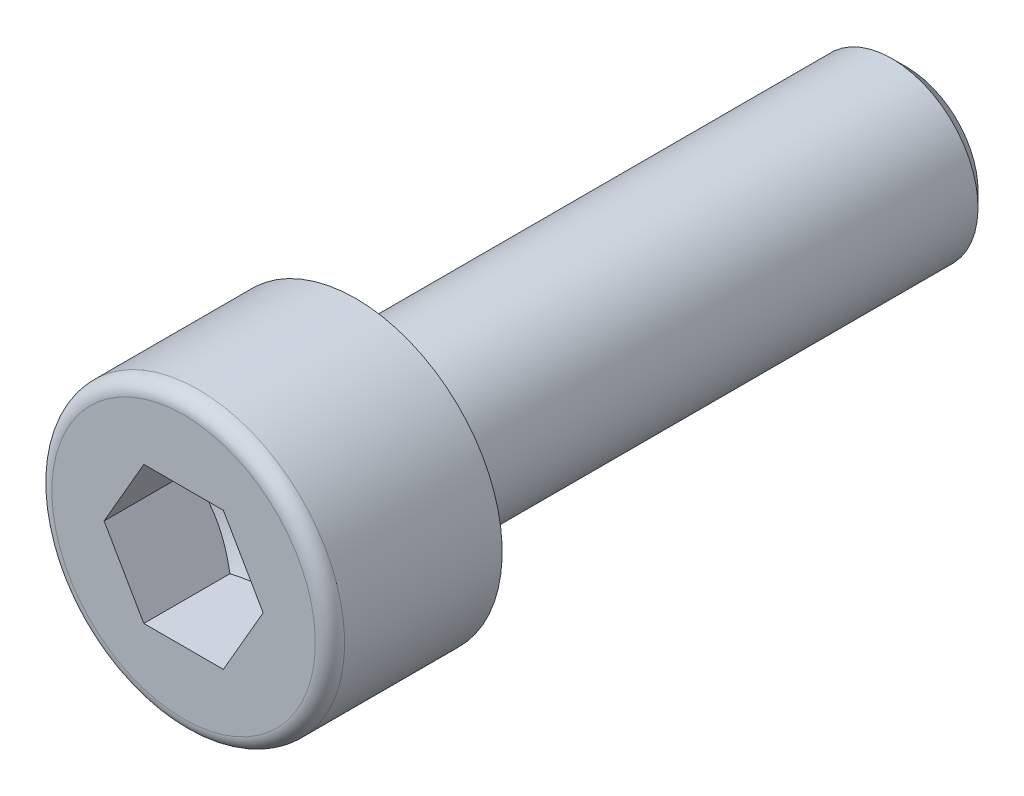
ISO-10303-21;
HEADER;
FILE_DESCRIPTION(('STEP AP214'),'2;1');
FILE_NAME('part.step','',(''),(''),'','','');
FILE_SCHEMA(('AUTOMOTIVE_DESIGN { 1 0 10303 214 1 1 1 1 }'));
ENDSEC;
DATA;
#1=APPLICATION_CONTEXT('core data for automotive mechanical design processes');
#2=APPLICATION_PROTOCOL_DEFINITION('international standard','automotive_design',2000,#1);
#3=PRODUCT_CONTEXT('',#1,'mechanical');
#4=PRODUCT('Part','Part','',(#3));
#5=PRODUCT_RELATED_PRODUCT_CATEGORY('part','',(#4));
#6=PRODUCT_DEFINITION_FORMATION('','',#4);
#7=PRODUCT_DEFINITION_CONTEXT('part definition',#1,'design');
#8=PRODUCT_DEFINITION('design','',#6,#7);
#9=PRODUCT_DEFINITION_SHAPE('','',#8);
#10=(LENGTH_UNIT() NAMED_UNIT(*) SI_UNIT(.MILLI.,.METRE.));
#11=(NAMED_UNIT(*) PLANE_ANGLE_UNIT() SI_UNIT($,.RADIAN.));
#12=(NAMED_UNIT(*) SI_UNIT($,.STERADIAN.) SOLID_ANGLE_UNIT());
#13=UNCERTAINTY_MEASURE_WITH_UNIT(LENGTH_MEASURE(1.E-05),#10,'distance_accuracy_value','');
#14=(GEOMETRIC_REPRESENTATION_CONTEXT(3) GLOBAL_UNCERTAINTY_ASSIGNED_CONTEXT((#13)) GLOBAL_UNIT_ASSIGNED_CONTEXT((#10,
#11,#12)) REPRESENTATION_CONTEXT('',''));
#15=CARTESIAN_POINT('',(0.,0.,0.));
#16=DIRECTION('',(0.,0.,1.));
#17=DIRECTION('',(1.,0.,0.));
#18=AXIS2_PLACEMENT_3D('',#15,#16,#17);
#19=CARTESIAN_POINT('',(0.,0.,1.83333364416674));
#20=DIRECTION('',(0.,0.,1.));
#21=DIRECTION('',(0.,1.,0.));
#22=AXIS2_PLACEMENT_3D('',#19,#20,#21);
#23=CONICAL_SURFACE('',#22,1.1547,1.0471975511966);
#24=CARTESIAN_POINT('',(1.1547,1.99999906749978,2.5));
#25=CARTESIAN_POINT('',(1.73205,0.999999533749893,2.16666682208337));
#26=CARTESIAN_POINT('',(2.3094,0.,2.5));
#27=(BOUNDED_CURVE() B_SPLINE_CURVE(2,(#24,#25,#26),.UNSPECIFIED.,.F.,
.F.) B_SPLINE_CURVE_WITH_KNOTS((3,3),(0.,2.33687118658889),
.UNSPECIFIED.) CURVE() GEOMETRIC_REPRESENTATION_ITEM() RATIONAL_B_SPLINE_CURVE((1.,
1.15470053837925,1.)) REPRESENTATION_ITEM(''));
#28=CARTESIAN_POINT('',(1.1547,1.99999906749978,2.5));
#29=VERTEX_POINT('',#28);
#30=CARTESIAN_POINT('',(2.3094,0.,2.5));
#31=VERTEX_POINT('',#30);
#32=EDGE_CURVE('E153',#29,#31,#27,.T.);
#33=ORIENTED_EDGE('',*,*,#32,.F.);
#34=CARTESIAN_POINT('',(-1.1547,1.99999906749978,2.5));
#35=CARTESIAN_POINT('',(0.,1.99999906749979,2.16666682208337));
#36=CARTESIAN_POINT('',(1.1547,1.99999906749978,2.5));
#37=(BOUNDED_CURVE() B_SPLINE_CURVE(2,(#34,#35,#36),.UNSPECIFIED.,.F.,
.F.) B_SPLINE_CURVE_WITH_KNOTS((3,3),(0.,2.33687118658889),
.UNSPECIFIED.) CURVE() GEOMETRIC_REPRESENTATION_ITEM() RATIONAL_B_SPLINE_CURVE((1.,
1.15470053837925,1.)) REPRESENTATION_ITEM(''));
#38=CARTESIAN_POINT('',(-1.1547,1.99999906749978,2.5));
#39=VERTEX_POINT('',#38);
#40=EDGE_CURVE('E37',#39,#29,#37,.T.);
#41=ORIENTED_EDGE('',*,*,#40,.F.);
#42=CARTESIAN_POINT('',(-2.3094,0.,2.5));
#43=CARTESIAN_POINT('',(-1.73205,0.999999533749893,2.16666682208337));
#44=CARTESIAN_POINT('',(-1.1547,1.99999906749978,2.5));
#45=(BOUNDED_CURVE() B_SPLINE_CURVE(2,(#42,#43,#44),.UNSPECIFIED.,.F.,
.F.) B_SPLINE_CURVE_WITH_KNOTS((3,3),(0.,2.33687118658889),
.UNSPECIFIED.) CURVE() GEOMETRIC_REPRESENTATION_ITEM() RATIONAL_B_SPLINE_CURVE((1.,
1.15470053837925,1.)) REPRESENTATION_ITEM(''));
#46=CARTESIAN_POINT('',(-2.3094,0.,2.5));
#47=VERTEX_POINT('',#46);
#48=EDGE_CURVE('E181',#47,#39,#45,.T.);
#49=ORIENTED_EDGE('',*,*,#48,.F.);
#50=CARTESIAN_POINT('',(-1.1547,-1.99999906749978,2.5));
#51=CARTESIAN_POINT('',(-1.73205,-0.999999533749891,2.16666682208337));
#52=CARTESIAN_POINT('',(-2.3094,0.,2.5));
#53=(BOUNDED_CURVE() B_SPLINE_CURVE(2,(#50,#51,#52),.UNSPECIFIED.,.F.,
.F.) B_SPLINE_CURVE_WITH_KNOTS((3,3),(0.,2.33687118658889),
.UNSPECIFIED.) CURVE() GEOMETRIC_REPRESENTATION_ITEM() RATIONAL_B_SPLINE_CURVE((1.,
1.15470053837925,1.)) REPRESENTATION_ITEM(''));
#54=CARTESIAN_POINT('',(-1.1547,-1.99999906749978,2.5));
#55=VERTEX_POINT('',#54);
#56=EDGE_CURVE('E11',#55,#47,#53,.T.);
#57=ORIENTED_EDGE('',*,*,#56,.F.);
#58=CARTESIAN_POINT('',(1.1547,-1.99999906749978,2.5));
#59=CARTESIAN_POINT('',(0.,-1.99999906749979,2.16666682208337));
#60=CARTESIAN_POINT('',(-1.1547,-1.99999906749978,2.5));
#61=(BOUNDED_CURVE() B_SPLINE_CURVE(2,(#58,#59,#60),.UNSPECIFIED.,.F.,
.F.) B_SPLINE_CURVE_WITH_KNOTS((3,3),(0.,2.33687118658889),
.UNSPECIFIED.) CURVE() GEOMETRIC_REPRESENTATION_ITEM() RATIONAL_B_SPLINE_CURVE((1.,
1.15470053837925,1.)) REPRESENTATION_ITEM(''));
#62=CARTESIAN_POINT('',(1.1547,-1.99999906749978,2.5));
#63=VERTEX_POINT('',#62);
#64=EDGE_CURVE('E52',#63,#55,#61,.T.);
#65=ORIENTED_EDGE('',*,*,#64,.F.);
#66=CARTESIAN_POINT('',(2.3094,0.,2.5));
#67=CARTESIAN_POINT('',(1.73205,-0.999999533749891,2.16666682208337));
#68=CARTESIAN_POINT('',(1.1547,-1.99999906749978,2.5));
#69=(BOUNDED_CURVE() B_SPLINE_CURVE(2,(#66,#67,#68),.UNSPECIFIED.,.F.,
.F.) B_SPLINE_CURVE_WITH_KNOTS((3,3),(0.,2.33687118658888),
.UNSPECIFIED.) CURVE() GEOMETRIC_REPRESENTATION_ITEM() RATIONAL_B_SPLINE_CURVE((1.,
1.15470053837925,1.)) REPRESENTATION_ITEM(''));
#70=EDGE_CURVE('E20',#31,#63,#69,.T.);
#71=ORIENTED_EDGE('',*,*,#70,.F.);
#72=EDGE_LOOP('',(#33,#41,#49,#57,#65,#71));
#73=FACE_BOUND('',#72,.T.);
#74=CARTESIAN_POINT('',(0.,0.,1.16666728833348));
#75=VERTEX_POINT('',#74);
#76=VERTEX_LOOP('',#75);
#77=FACE_BOUND('',#76,.T.);
#78=ADVANCED_FACE('F16',(#73,#77),#23,.F.);
#79=CARTESIAN_POINT('',(-1.73205,-0.999999533749891,5.));
#80=DIRECTION('',(-0.866025403784439,-0.5,0.));
#81=DIRECTION('',(-0.5,0.866025403784439,0.));
#82=AXIS2_PLACEMENT_3D('',#79,#80,#81);
#83=PLANE('',#82);
#84=ORIENTED_EDGE('',*,*,#56,.T.);
#85=DIRECTION('',(0.,0.,-1.));
#86=VECTOR('',#85,1.);
#87=CARTESIAN_POINT('',(-2.3094,0.,5.));
#88=LINE('',#87,#86);
#89=CARTESIAN_POINT('',(-2.3094,0.,5.));
#90=VERTEX_POINT('',#89);
#91=EDGE_CURVE('E179',#90,#47,#88,.T.);
#92=ORIENTED_EDGE('',*,*,#91,.F.);
#93=DIRECTION('',(-0.5,0.866025403784439,0.));
#94=VECTOR('',#93,1.);
#95=CARTESIAN_POINT('',(-2.14611839618444,-0.282812033749892,5.));
#96=LINE('',#95,#94);
#97=CARTESIAN_POINT('',(-1.1547,-1.99999906749978,5.));
#98=VERTEX_POINT('',#97);
#99=EDGE_CURVE('E133',#98,#90,#96,.T.);
#100=ORIENTED_EDGE('',*,*,#99,.F.);
#101=DIRECTION('',(0.,0.,-1.));
#102=VECTOR('',#101,1.);
#103=CARTESIAN_POINT('',(-1.1547,-1.99999906749978,5.));
#104=LINE('',#103,#102);
#105=EDGE_CURVE('E28',#98,#55,#104,.T.);
#106=ORIENTED_EDGE('',*,*,#105,.T.);
#107=EDGE_LOOP('',(#84,#92,#100,#106));
#108=FACE_BOUND('',#107,.T.);
#109=ADVANCED_FACE('F221',(#108),#83,.F.);
#110=CARTESIAN_POINT('',(0.,-1.99999906749978,5.));
#111=DIRECTION('',(0.,-1.,0.));
#112=DIRECTION('',(-1.,0.,0.));
#113=AXIS2_PLACEMENT_3D('',#110,#111,#112);
#114=PLANE('',#113);
#115=ORIENTED_EDGE('',*,*,#64,.T.);
#116=ORIENTED_EDGE('',*,*,#105,.F.);
#117=DIRECTION('',(-1.,0.,0.));
#118=VECTOR('',#117,1.);
#119=CARTESIAN_POINT('',(0.,-1.99999906749978,5.));
#120=LINE('',#119,#118);
#121=CARTESIAN_POINT('',(1.1547,-1.99999906749978,5.));
#122=VERTEX_POINT('',#121);
#123=EDGE_CURVE('E110',#122,#98,#120,.T.);
#124=ORIENTED_EDGE('',*,*,#123,.F.);
#125=DIRECTION('',(0.,0.,-1.));
#126=VECTOR('',#125,1.);
#127=CARTESIAN_POINT('',(1.1547,-1.99999906749978,5.));
#128=LINE('',#127,#126);
#129=EDGE_CURVE('E111',#122,#63,#128,.T.);
#130=ORIENTED_EDGE('',*,*,#129,.T.);
#131=EDGE_LOOP('',(#115,#116,#124,#130));
#132=FACE_BOUND('',#131,.T.);
#133=ADVANCED_FACE('F18',(#132),#114,.F.);
#134=CARTESIAN_POINT('',(1.73205,-0.999999533749891,5.));
#135=DIRECTION('',(0.866025403784439,-0.5,0.));
#136=DIRECTION('',(-0.5,-0.866025403784439,0.));
#137=AXIS2_PLACEMENT_3D('',#134,#135,#136);
#138=PLANE('',#137);
#139=ORIENTED_EDGE('',*,*,#70,.T.);
#140=ORIENTED_EDGE('',*,*,#129,.F.);
#141=DIRECTION('',(-0.5,-0.866025403784439,0.));
#142=VECTOR('',#141,1.);
#143=CARTESIAN_POINT('',(2.14611839618444,-0.282812033749892,5.));
#144=LINE('',#143,#142);
#145=CARTESIAN_POINT('',(2.3094,0.,5.));
#146=VERTEX_POINT('',#145);
#147=EDGE_CURVE('E115',#146,#122,#144,.T.);
#148=ORIENTED_EDGE('',*,*,#147,.F.);
#149=DIRECTION('',(0.,0.,-1.));
#150=VECTOR('',#149,1.);
#151=CARTESIAN_POINT('',(2.3094,0.,5.));
#152=LINE('',#151,#150);
#153=EDGE_CURVE('E152',#146,#31,#152,.T.);
#154=ORIENTED_EDGE('',*,*,#153,.T.);
#155=EDGE_LOOP('',(#139,#140,#148,#154));
#156=FACE_BOUND('',#155,.T.);
#157=ADVANCED_FACE('F117',(#156),#138,.F.);
#158=CARTESIAN_POINT('',(1.73205,0.999999533749891,5.));
#159=DIRECTION('',(0.866025403784439,0.5,0.));
#160=DIRECTION('',(0.5,-0.866025403784439,0.));
#161=AXIS2_PLACEMENT_3D('',#158,#159,#160);
#162=PLANE('',#161);
#163=ORIENTED_EDGE('',*,*,#32,.T.);
#164=ORIENTED_EDGE('',*,*,#153,.F.);
#165=DIRECTION('',(0.5,-0.866025403784439,0.));
#166=VECTOR('',#165,1.);
#167=CARTESIAN_POINT('',(1.31798160381557,1.71718703374989,5.));
#168=LINE('',#167,#166);
#169=CARTESIAN_POINT('',(1.1547,1.99999906749978,5.));
#170=VERTEX_POINT('',#169);
#171=EDGE_CURVE('E125',#170,#146,#168,.T.);
#172=ORIENTED_EDGE('',*,*,#171,.F.);
#173=DIRECTION('',(0.,0.,-1.));
#174=VECTOR('',#173,1.);
#175=CARTESIAN_POINT('',(1.1547,1.99999906749978,5.));
#176=LINE('',#175,#174);
#177=EDGE_CURVE('E154',#170,#29,#176,.T.);
#178=ORIENTED_EDGE('',*,*,#177,.T.);
#179=EDGE_LOOP('',(#163,#164,#172,#178));
#180=FACE_BOUND('',#179,.T.);
#181=ADVANCED_FACE('F232',(#180),#162,.F.);
#182=CARTESIAN_POINT('',(0.,1.99999906749978,5.));
#183=DIRECTION('',(0.,1.,0.));
#184=DIRECTION('',(1.,0.,0.));
#185=AXIS2_PLACEMENT_3D('',#182,#183,#184);
#186=PLANE('',#185);
#187=ORIENTED_EDGE('',*,*,#40,.T.);
#188=ORIENTED_EDGE('',*,*,#177,.F.);
#189=DIRECTION('',(1.,0.,0.));
#190=VECTOR('',#189,1.);
#191=CARTESIAN_POINT('',(0.,1.99999906749978,5.));
#192=LINE('',#191,#190);
#193=CARTESIAN_POINT('',(-1.1547,1.99999906749978,5.));
#194=VERTEX_POINT('',#193);
#195=EDGE_CURVE('E127',#194,#170,#192,.T.);
#196=ORIENTED_EDGE('',*,*,#195,.F.);
#197=DIRECTION('',(0.,0.,-1.));
#198=VECTOR('',#197,1.);
#199=CARTESIAN_POINT('',(-1.1547,1.99999906749978,5.));
#200=LINE('',#199,#198);
#201=EDGE_CURVE('E191',#194,#39,#200,.T.);
#202=ORIENTED_EDGE('',*,*,#201,.T.);
#203=EDGE_LOOP('',(#187,#188,#196,#202));
#204=FACE_BOUND('',#203,.T.);
#205=ADVANCED_FACE('F234',(#204),#186,.F.);
#206=CARTESIAN_POINT('',(-1.73205,0.999999533749891,5.));
#207=DIRECTION('',(-0.866025403784439,0.5,0.));
#208=DIRECTION('',(0.5,0.866025403784439,0.));
#209=AXIS2_PLACEMENT_3D('',#206,#207,#208);
#210=PLANE('',#209);
#211=ORIENTED_EDGE('',*,*,#48,.T.);
#212=ORIENTED_EDGE('',*,*,#201,.F.);
#213=DIRECTION('',(0.5,0.866025403784439,0.));
#214=VECTOR('',#213,1.);
#215=CARTESIAN_POINT('',(-1.31798160381557,1.71718703374989,5.));
#216=LINE('',#215,#214);
#217=EDGE_CURVE('E131',#90,#194,#216,.T.);
#218=ORIENTED_EDGE('',*,*,#217,.F.);
#219=ORIENTED_EDGE('',*,*,#91,.T.);
#220=EDGE_LOOP('',(#211,#212,#218,#219));
#221=FACE_BOUND('',#220,.T.);
#222=ADVANCED_FACE('F207',(#221),#210,.F.);
#223=CARTESIAN_POINT('',(0.,0.,4.575));
#224=DIRECTION('',(0.,0.,-1.));
#225=DIRECTION('',(-1.,0.,0.));
#226=AXIS2_PLACEMENT_3D('',#223,#224,#225);
#227=TOROIDAL_SURFACE('',#226,3.825,0.425);
#228=CARTESIAN_POINT('',(0.,0.,4.575));
#229=DIRECTION('',(0.,0.,-1.));
#230=DIRECTION('',(0.,1.,0.));
#231=AXIS2_PLACEMENT_3D('',#228,#229,#230);
#232=CIRCLE('',#231,4.25);
#233=CARTESIAN_POINT('',(0.,4.25,4.575));
#234=VERTEX_POINT('',#233);
#235=EDGE_CURVE('E184',#234,#234,#232,.T.);
#236=ORIENTED_EDGE('',*,*,#235,.F.);
#237=EDGE_LOOP('',(#236));
#238=FACE_BOUND('',#237,.T.);
#239=CARTESIAN_POINT('',(0.,0.,5.));
#240=DIRECTION('',(0.,0.,-1.));
#241=DIRECTION('',(0.,1.,0.));
#242=AXIS2_PLACEMENT_3D('',#239,#240,#241);
#243=CIRCLE('',#242,3.825);
#244=CARTESIAN_POINT('',(0.,3.825,5.));
#245=VERTEX_POINT('',#244);
#246=EDGE_CURVE('E182',#245,#245,#243,.T.);
#247=ORIENTED_EDGE('',*,*,#246,.T.);
#248=EDGE_LOOP('',(#247));
#249=FACE_BOUND('',#248,.T.);
#250=ADVANCED_FACE('F202',(#238,#249),#227,.T.);
#251=CARTESIAN_POINT('',(0.,0.,2.2875));
#252=DIRECTION('',(0.,0.,1.));
#253=DIRECTION('',(0.,1.,0.));
#254=AXIS2_PLACEMENT_3D('',#251,#252,#253);
#255=CYLINDRICAL_SURFACE('',#254,4.25);
#256=CARTESIAN_POINT('',(0.,0.,0.));
#257=DIRECTION('',(0.,0.,-1.));
#258=DIRECTION('',(0.,1.,0.));
#259=AXIS2_PLACEMENT_3D('',#256,#257,#258);
#260=CIRCLE('',#259,4.25);
#261=CARTESIAN_POINT('',(0.,4.25,0.));
#262=VERTEX_POINT('',#261);
#263=EDGE_CURVE('E150',#262,#262,#260,.T.);
#264=ORIENTED_EDGE('',*,*,#263,.F.);
#265=EDGE_LOOP('',(#264));
#266=FACE_BOUND('',#265,.T.);
#267=ORIENTED_EDGE('',*,*,#235,.T.);
#268=EDGE_LOOP('',(#267));
#269=FACE_BOUND('',#268,.T.);
#270=ADVANCED_FACE('F199',(#266,#269),#255,.T.);
#271=CARTESIAN_POINT('',(0.,3.5,0.));
#272=DIRECTION('',(0.,0.,-1.));
#273=DIRECTION('',(0.,1.,0.));
#274=AXIS2_PLACEMENT_3D('',#271,#272,#273);
#275=PLANE('',#274);
#276=CARTESIAN_POINT('',(0.,0.,0.));
#277=DIRECTION('',(0.,0.,-1.));
#278=DIRECTION('',(0.,1.,0.));
#279=AXIS2_PLACEMENT_3D('',#276,#277,#278);
#280=CIRCLE('',#279,2.75);
#281=CARTESIAN_POINT('',(0.,2.75,0.));
#282=VERTEX_POINT('',#281);
#283=EDGE_CURVE('E147',#282,#282,#280,.T.);
#284=ORIENTED_EDGE('',*,*,#283,.F.);
#285=EDGE_LOOP('',(#284));
#286=FACE_BOUND('',#285,.T.);
#287=ORIENTED_EDGE('',*,*,#263,.T.);
#288=EDGE_LOOP('',(#287));
#289=FACE_BOUND('',#288,.T.);
#290=ADVANCED_FACE('F197',(#286,#289),#275,.T.);
#291=CARTESIAN_POINT('',(0.,0.,-0.25));
#292=DIRECTION('',(0.,0.,-1.));
#293=DIRECTION('',(-1.,0.,0.));
#294=AXIS2_PLACEMENT_3D('',#291,#292,#293);
#295=TOROIDAL_SURFACE('',#294,2.75,0.25);
#296=CARTESIAN_POINT('',(0.,0.,-0.25));
#297=DIRECTION('',(0.,0.,-1.));
#298=DIRECTION('',(0.,1.,0.));
#299=AXIS2_PLACEMENT_3D('',#296,#297,#298);
#300=CIRCLE('',#299,2.5);
#301=CARTESIAN_POINT('',(0.,2.5,-0.25));
#302=VERTEX_POINT('',#301);
#303=EDGE_CURVE('E151',#302,#302,#300,.T.);
#304=ORIENTED_EDGE('',*,*,#303,.F.);
#305=EDGE_LOOP('',(#304));
#306=FACE_BOUND('',#305,.T.);
#307=ORIENTED_EDGE('',*,*,#283,.T.);
#308=EDGE_LOOP('',(#307));
#309=FACE_BOUND('',#308,.T.);
#310=ADVANCED_FACE('F277',(#306,#309),#295,.F.);
#311=CARTESIAN_POINT('',(0.,0.,-0.275));
#312=DIRECTION('',(0.,0.,1.));
#313=DIRECTION('',(0.,1.,0.));
#314=AXIS2_PLACEMENT_3D('',#311,#312,#313);
#315=CYLINDRICAL_SURFACE('',#314,2.5);
#316=CARTESIAN_POINT('',(0.,0.,-0.3));
#317=DIRECTION('',(0.,0.,-1.));
#318=DIRECTION('',(0.,1.,0.));
#319=AXIS2_PLACEMENT_3D('',#316,#317,#318);
#320=CIRCLE('',#319,2.5);
#321=CARTESIAN_POINT('',(0.,2.5,-0.3));
#322=VERTEX_POINT('',#321);
#323=EDGE_CURVE('E170',#322,#322,#320,.T.);
#324=ORIENTED_EDGE('',*,*,#323,.F.);
#325=EDGE_LOOP('',(#324));
#326=FACE_BOUND('',#325,.T.);
#327=ORIENTED_EDGE('',*,*,#303,.T.);
#328=EDGE_LOOP('',(#327));
#329=FACE_BOUND('',#328,.T.);
#330=ADVANCED_FACE('F273',(#326,#329),#315,.T.);
#331=CARTESIAN_POINT('',(0.,0.,-0.5165));
#332=DIRECTION('',(0.,0.,1.));
#333=DIRECTION('',(0.,1.,0.));
#334=AXIS2_PLACEMENT_3D('',#331,#332,#333);
#335=CONICAL_SURFACE('',#334,2.2835,0.785398163397449);
#336=CARTESIAN_POINT('',(0.,0.,-0.733));
#337=DIRECTION('',(0.,0.,-1.));
#338=DIRECTION('',(0.,1.,0.));
#339=AXIS2_PLACEMENT_3D('',#336,#337,#338);
#340=CIRCLE('',#339,2.067);
#341=CARTESIAN_POINT('',(0.,2.067,-0.733));
#342=VERTEX_POINT('',#341);
#343=EDGE_CURVE('E176',#342,#342,#340,.T.);
#344=ORIENTED_EDGE('',*,*,#343,.F.);
#345=EDGE_LOOP('',(#344));
#346=FACE_BOUND('',#345,.T.);
#347=ORIENTED_EDGE('',*,*,#323,.T.);
#348=EDGE_LOOP('',(#347));
#349=FACE_BOUND('',#348,.T.);
#350=ADVANCED_FACE('F268',(#346,#349),#335,.T.);
#351=CARTESIAN_POINT('',(0.,2.2835,-0.733));
#352=DIRECTION('',(0.,0.,1.));
#353=DIRECTION('',(0.,-1.,0.));
#354=AXIS2_PLACEMENT_3D('',#351,#352,#353);
#355=PLANE('',#354);
#356=CARTESIAN_POINT('',(0.,0.,-0.733));
#357=DIRECTION('',(0.,0.,-1.));
#358=DIRECTION('',(0.,1.,0.));
#359=AXIS2_PLACEMENT_3D('',#356,#357,#358);
#360=CIRCLE('',#359,2.5);
#361=CARTESIAN_POINT('',(0.,2.5,-0.733));
#362=VERTEX_POINT('',#361);
#363=EDGE_CURVE('E162',#362,#362,#360,.T.);
#364=ORIENTED_EDGE('',*,*,#363,.F.);
#365=EDGE_LOOP('',(#364));
#366=FACE_BOUND('',#365,.T.);
#367=ORIENTED_EDGE('',*,*,#343,.T.);
#368=EDGE_LOOP('',(#367));
#369=FACE_BOUND('',#368,.T.);
#370=ADVANCED_FACE('F262',(#366,#369),#355,.T.);
#371=CARTESIAN_POINT('',(0.,0.,-8.15));
#372=DIRECTION('',(0.,0.,1.));
#373=DIRECTION('',(0.,1.,0.));
#374=AXIS2_PLACEMENT_3D('',#371,#372,#373);
#375=CYLINDRICAL_SURFACE('',#374,2.5);
#376=CARTESIAN_POINT('',(0.,0.,-15.567));
#377=DIRECTION('',(0.,0.,-1.));
#378=DIRECTION('',(0.,1.,0.));
#379=AXIS2_PLACEMENT_3D('',#376,#377,#378);
#380=CIRCLE('',#379,2.5);
#381=CARTESIAN_POINT('',(0.,2.5,-15.567));
#382=VERTEX_POINT('',#381);
#383=EDGE_CURVE('E252',#382,#382,#380,.T.);
#384=ORIENTED_EDGE('',*,*,#383,.F.);
#385=EDGE_LOOP('',(#384));
#386=FACE_BOUND('',#385,.T.);
#387=ORIENTED_EDGE('',*,*,#363,.T.);
#388=EDGE_LOOP('',(#387));
#389=FACE_BOUND('',#388,.T.);
#390=ADVANCED_FACE('F238',(#386,#389),#375,.T.);
#391=CARTESIAN_POINT('',(0.,0.,-15.7835));
#392=DIRECTION('',(0.,0.,1.));
#393=DIRECTION('',(0.,1.,0.));
#394=AXIS2_PLACEMENT_3D('',#391,#392,#393);
#395=CONICAL_SURFACE('',#394,2.2835,0.785398163397448);
#396=CARTESIAN_POINT('',(0.,0.,-16.));
#397=DIRECTION('',(0.,0.,-1.));
#398=DIRECTION('',(0.,1.,0.));
#399=AXIS2_PLACEMENT_3D('',#396,#397,#398);
#400=CIRCLE('',#399,2.067);
#401=CARTESIAN_POINT('',(0.,2.067,-16.));
#402=VERTEX_POINT('',#401);
#403=EDGE_CURVE('E134',#402,#402,#400,.T.);
#404=ORIENTED_EDGE('',*,*,#403,.F.);
#405=EDGE_LOOP('',(#404));
#406=FACE_BOUND('',#405,.T.);
#407=ORIENTED_EDGE('',*,*,#383,.T.);
#408=EDGE_LOOP('',(#407));
#409=FACE_BOUND('',#408,.T.);
#410=ADVANCED_FACE('F216',(#406,#409),#395,.T.);
#411=CARTESIAN_POINT('',(0.,1.0335,-16.));
#412=DIRECTION('',(0.,0.,-1.));
#413=DIRECTION('',(0.,1.,0.));
#414=AXIS2_PLACEMENT_3D('',#411,#412,#413);
#415=PLANE('',#414);
#416=ORIENTED_EDGE('',*,*,#403,.T.);
#417=EDGE_LOOP('',(#416));
#418=FACE_BOUND('',#417,.T.);
#419=ADVANCED_FACE('F210',(#418),#415,.T.);
#420=CARTESIAN_POINT('',(0.,1.9125,5.));
#421=DIRECTION('',(0.,0.,1.));
#422=DIRECTION('',(0.,-1.,0.));
#423=AXIS2_PLACEMENT_3D('',#420,#421,#422);
#424=PLANE('',#423);
#425=ORIENTED_EDGE('',*,*,#99,.T.);
#426=ORIENTED_EDGE('',*,*,#217,.T.);
#427=ORIENTED_EDGE('',*,*,#195,.T.);
#428=ORIENTED_EDGE('',*,*,#171,.T.);
#429=ORIENTED_EDGE('',*,*,#147,.T.);
#430=ORIENTED_EDGE('',*,*,#123,.T.);
#431=EDGE_LOOP('',(#425,#426,#427,#428,#429,#430));
#432=FACE_BOUND('',#431,.T.);
#433=ORIENTED_EDGE('',*,*,#246,.F.);
#434=EDGE_LOOP('',(#433));
#435=FACE_BOUND('',#434,.T.);
#436=ADVANCED_FACE('F121',(#432,#435),#424,.T.);
#437=CLOSED_SHELL('',(#78,#109,#133,#157,#181,#205,#222,#250,#270,#290,#310,#330,#350,#370,#390,
#410,#419,#436));
#438=MANIFOLD_SOLID_BREP('B1',#437);
#439=ADVANCED_BREP_SHAPE_REPRESENTATION('',(#18,#438),#14);
#440=SHAPE_DEFINITION_REPRESENTATION(#9,#439);
ENDSEC;
END-ISO-10303-21;
